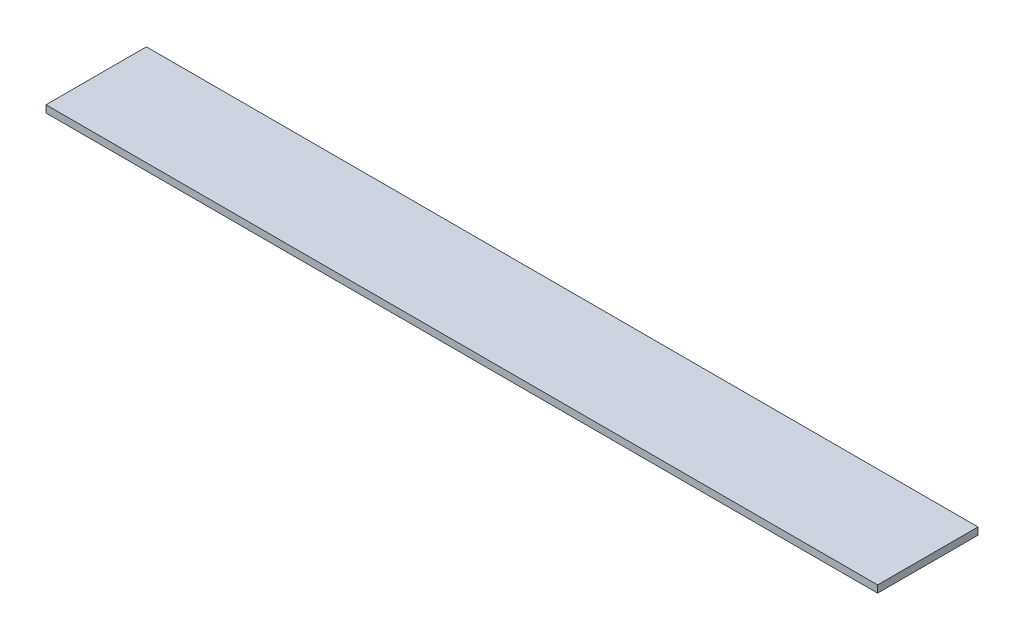
ISO-10303-21;
HEADER;
FILE_DESCRIPTION(('STEP AP214'),'2;1');
FILE_NAME('part.step','',(''),(''),'','','');
FILE_SCHEMA(('AUTOMOTIVE_DESIGN { 1 0 10303 214 1 1 1 1 }'));
ENDSEC;
DATA;
#1=APPLICATION_CONTEXT('core data for automotive mechanical design processes');
#2=APPLICATION_PROTOCOL_DEFINITION('international standard','automotive_design',2000,#1);
#3=PRODUCT_CONTEXT('',#1,'mechanical');
#4=PRODUCT('Part','Part','',(#3));
#5=PRODUCT_RELATED_PRODUCT_CATEGORY('part','',(#4));
#6=PRODUCT_DEFINITION_FORMATION('','',#4);
#7=PRODUCT_DEFINITION_CONTEXT('part definition',#1,'design');
#8=PRODUCT_DEFINITION('design','',#6,#7);
#9=PRODUCT_DEFINITION_SHAPE('','',#8);
#10=(LENGTH_UNIT() NAMED_UNIT(*) SI_UNIT(.MILLI.,.METRE.));
#11=(NAMED_UNIT(*) PLANE_ANGLE_UNIT() SI_UNIT($,.RADIAN.));
#12=(NAMED_UNIT(*) SI_UNIT($,.STERADIAN.) SOLID_ANGLE_UNIT());
#13=UNCERTAINTY_MEASURE_WITH_UNIT(LENGTH_MEASURE(1.E-05),#10,'distance_accuracy_value','');
#14=(GEOMETRIC_REPRESENTATION_CONTEXT(3) GLOBAL_UNCERTAINTY_ASSIGNED_CONTEXT((#13)) GLOBAL_UNIT_ASSIGNED_CONTEXT((#10,
#11,#12)) REPRESENTATION_CONTEXT('',''));
#15=CARTESIAN_POINT('',(0.,0.,0.));
#16=DIRECTION('',(0.,0.,1.));
#17=DIRECTION('',(1.,0.,0.));
#18=AXIS2_PLACEMENT_3D('',#15,#16,#17);
#19=CARTESIAN_POINT('',(-290.,5.,-35.));
#20=DIRECTION('',(1.,0.,0.));
#21=DIRECTION('',(0.,0.,-1.));
#22=AXIS2_PLACEMENT_3D('',#19,#20,#21);
#23=PLANE('',#22);
#24=DIRECTION('',(0.,0.,1.));
#25=VECTOR('',#24,1.);
#26=CARTESIAN_POINT('',(-290.,0.,-35.));
#27=LINE('',#26,#25);
#28=CARTESIAN_POINT('',(-290.,0.,-35.));
#29=VERTEX_POINT('',#28);
#30=CARTESIAN_POINT('',(-290.,0.,35.));
#31=VERTEX_POINT('',#30);
#32=EDGE_CURVE('E100',#29,#31,#27,.T.);
#33=ORIENTED_EDGE('',*,*,#32,.T.);
#34=DIRECTION('',(0.,-1.,0.));
#35=VECTOR('',#34,1.);
#36=CARTESIAN_POINT('',(-290.,5.,35.));
#37=LINE('',#36,#35);
#38=CARTESIAN_POINT('',(-290.,5.,35.));
#39=VERTEX_POINT('',#38);
#40=EDGE_CURVE('E11',#39,#31,#37,.T.);
#41=ORIENTED_EDGE('',*,*,#40,.F.);
#42=DIRECTION('',(0.,0.,1.));
#43=VECTOR('',#42,1.);
#44=CARTESIAN_POINT('',(-290.,5.,-35.));
#45=LINE('',#44,#43);
#46=CARTESIAN_POINT('',(-290.,5.,-35.));
#47=VERTEX_POINT('',#46);
#48=EDGE_CURVE('E88',#47,#39,#45,.T.);
#49=ORIENTED_EDGE('',*,*,#48,.F.);
#50=DIRECTION('',(0.,-1.,0.));
#51=VECTOR('',#50,1.);
#52=CARTESIAN_POINT('',(-290.,5.,-35.));
#53=LINE('',#52,#51);
#54=EDGE_CURVE('E96',#47,#29,#53,.T.);
#55=ORIENTED_EDGE('',*,*,#54,.T.);
#56=EDGE_LOOP('',(#33,#41,#49,#55));
#57=FACE_BOUND('',#56,.T.);
#58=ADVANCED_FACE('F37',(#57),#23,.F.);
#59=CARTESIAN_POINT('',(-290.,5.,35.));
#60=DIRECTION('',(0.,0.,-1.));
#61=DIRECTION('',(-1.,0.,0.));
#62=AXIS2_PLACEMENT_3D('',#59,#60,#61);
#63=PLANE('',#62);
#64=DIRECTION('',(1.,0.,0.));
#65=VECTOR('',#64,1.);
#66=CARTESIAN_POINT('',(-290.,0.,35.));
#67=LINE('',#66,#65);
#68=CARTESIAN_POINT('',(290.,0.,35.));
#69=VERTEX_POINT('',#68);
#70=EDGE_CURVE('E92',#31,#69,#67,.T.);
#71=ORIENTED_EDGE('',*,*,#70,.T.);
#72=DIRECTION('',(0.,-1.,0.));
#73=VECTOR('',#72,1.);
#74=CARTESIAN_POINT('',(290.,5.,35.));
#75=LINE('',#74,#73);
#76=CARTESIAN_POINT('',(290.,5.,35.));
#77=VERTEX_POINT('',#76);
#78=EDGE_CURVE('E45',#77,#69,#75,.T.);
#79=ORIENTED_EDGE('',*,*,#78,.F.);
#80=DIRECTION('',(1.,0.,0.));
#81=VECTOR('',#80,1.);
#82=CARTESIAN_POINT('',(-290.,5.,35.));
#83=LINE('',#82,#81);
#84=EDGE_CURVE('E83',#39,#77,#83,.T.);
#85=ORIENTED_EDGE('',*,*,#84,.F.);
#86=ORIENTED_EDGE('',*,*,#40,.T.);
#87=EDGE_LOOP('',(#71,#79,#85,#86));
#88=FACE_BOUND('',#87,.T.);
#89=ADVANCED_FACE('F91',(#88),#63,.F.);
#90=CARTESIAN_POINT('',(290.,5.,-35.));
#91=DIRECTION('',(-1.,0.,0.));
#92=DIRECTION('',(0.,0.,1.));
#93=AXIS2_PLACEMENT_3D('',#90,#91,#92);
#94=PLANE('',#93);
#95=DIRECTION('',(0.,0.,-1.));
#96=VECTOR('',#95,1.);
#97=CARTESIAN_POINT('',(290.,0.,-35.));
#98=LINE('',#97,#96);
#99=CARTESIAN_POINT('',(290.,0.,-35.));
#100=VERTEX_POINT('',#99);
#101=EDGE_CURVE('E70',#69,#100,#98,.T.);
#102=ORIENTED_EDGE('',*,*,#101,.T.);
#103=DIRECTION('',(0.,-1.,0.));
#104=VECTOR('',#103,1.);
#105=CARTESIAN_POINT('',(290.,5.,-35.));
#106=LINE('',#105,#104);
#107=CARTESIAN_POINT('',(290.,5.,-35.));
#108=VERTEX_POINT('',#107);
#109=EDGE_CURVE('E93',#108,#100,#106,.T.);
#110=ORIENTED_EDGE('',*,*,#109,.F.);
#111=DIRECTION('',(0.,0.,-1.));
#112=VECTOR('',#111,1.);
#113=CARTESIAN_POINT('',(290.,5.,-35.));
#114=LINE('',#113,#112);
#115=EDGE_CURVE('E86',#77,#108,#114,.T.);
#116=ORIENTED_EDGE('',*,*,#115,.F.);
#117=ORIENTED_EDGE('',*,*,#78,.T.);
#118=EDGE_LOOP('',(#102,#110,#116,#117));
#119=FACE_BOUND('',#118,.T.);
#120=ADVANCED_FACE('F94',(#119),#94,.F.);
#121=CARTESIAN_POINT('',(-290.,5.,-35.));
#122=DIRECTION('',(0.,0.,1.));
#123=DIRECTION('',(1.,0.,0.));
#124=AXIS2_PLACEMENT_3D('',#121,#122,#123);
#125=PLANE('',#124);
#126=DIRECTION('',(-1.,0.,0.));
#127=VECTOR('',#126,1.);
#128=CARTESIAN_POINT('',(-290.,0.,-35.));
#129=LINE('',#128,#127);
#130=EDGE_CURVE('E76',#100,#29,#129,.T.);
#131=ORIENTED_EDGE('',*,*,#130,.T.);
#132=ORIENTED_EDGE('',*,*,#54,.F.);
#133=DIRECTION('',(-1.,0.,0.));
#134=VECTOR('',#133,1.);
#135=CARTESIAN_POINT('',(-290.,5.,-35.));
#136=LINE('',#135,#134);
#137=EDGE_CURVE('E53',#108,#47,#136,.T.);
#138=ORIENTED_EDGE('',*,*,#137,.F.);
#139=ORIENTED_EDGE('',*,*,#109,.T.);
#140=EDGE_LOOP('',(#131,#132,#138,#139));
#141=FACE_BOUND('',#140,.T.);
#142=ADVANCED_FACE('F107',(#141),#125,.F.);
#143=CARTESIAN_POINT('',(0.,5.,0.));
#144=DIRECTION('',(0.,1.,0.));
#145=DIRECTION('',(0.,0.,1.));
#146=AXIS2_PLACEMENT_3D('',#143,#144,#145);
#147=PLANE('',#146);
#148=ORIENTED_EDGE('',*,*,#48,.T.);
#149=ORIENTED_EDGE('',*,*,#84,.T.);
#150=ORIENTED_EDGE('',*,*,#115,.T.);
#151=ORIENTED_EDGE('',*,*,#137,.T.);
#152=EDGE_LOOP('',(#148,#149,#150,#151));
#153=FACE_BOUND('',#152,.T.);
#154=ADVANCED_FACE('F84',(#153),#147,.T.);
#155=CARTESIAN_POINT('',(0.,0.,0.));
#156=DIRECTION('',(0.,1.,0.));
#157=DIRECTION('',(0.,0.,1.));
#158=AXIS2_PLACEMENT_3D('',#155,#156,#157);
#159=PLANE('',#158);
#160=ORIENTED_EDGE('',*,*,#32,.F.);
#161=ORIENTED_EDGE('',*,*,#130,.F.);
#162=ORIENTED_EDGE('',*,*,#101,.F.);
#163=ORIENTED_EDGE('',*,*,#70,.F.);
#164=EDGE_LOOP('',(#160,#161,#162,#163));
#165=FACE_BOUND('',#164,.T.);
#166=ADVANCED_FACE('F110',(#165),#159,.F.);
#167=CLOSED_SHELL('',(#58,#89,#120,#142,#154,#166));
#168=MANIFOLD_SOLID_BREP('B2',#167);
#169=ADVANCED_BREP_SHAPE_REPRESENTATION('',(#18,#168),#14);
#170=SHAPE_DEFINITION_REPRESENTATION(#9,#169);
ENDSEC;
END-ISO-10303-21;
